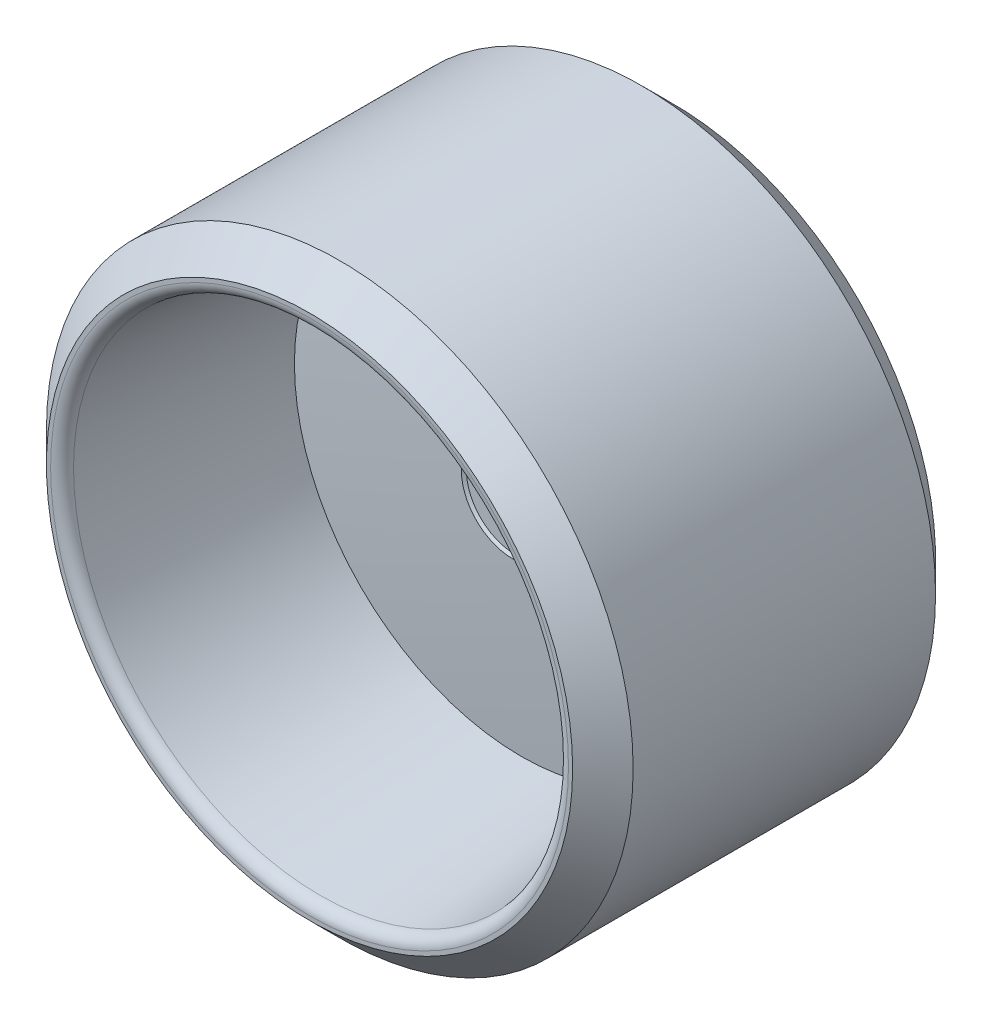
ISO-10303-21;
HEADER;
FILE_DESCRIPTION(('STEP AP214'),'2;1');
FILE_NAME('part.step','',(''),(''),'','','');
FILE_SCHEMA(('AUTOMOTIVE_DESIGN { 1 0 10303 214 1 1 1 1 }'));
ENDSEC;
DATA;
#1=APPLICATION_CONTEXT('core data for automotive mechanical design processes');
#2=APPLICATION_PROTOCOL_DEFINITION('international standard','automotive_design',2000,#1);
#3=PRODUCT_CONTEXT('',#1,'mechanical');
#4=PRODUCT('Part','Part','',(#3));
#5=PRODUCT_RELATED_PRODUCT_CATEGORY('part','',(#4));
#6=PRODUCT_DEFINITION_FORMATION('','',#4);
#7=PRODUCT_DEFINITION_CONTEXT('part definition',#1,'design');
#8=PRODUCT_DEFINITION('design','',#6,#7);
#9=PRODUCT_DEFINITION_SHAPE('','',#8);
#10=(LENGTH_UNIT() NAMED_UNIT(*) SI_UNIT(.MILLI.,.METRE.));
#11=(NAMED_UNIT(*) PLANE_ANGLE_UNIT() SI_UNIT($,.RADIAN.));
#12=(NAMED_UNIT(*) SI_UNIT($,.STERADIAN.) SOLID_ANGLE_UNIT());
#13=UNCERTAINTY_MEASURE_WITH_UNIT(LENGTH_MEASURE(1.E-05),#10,'distance_accuracy_value','');
#14=(GEOMETRIC_REPRESENTATION_CONTEXT(3) GLOBAL_UNCERTAINTY_ASSIGNED_CONTEXT((#13)) GLOBAL_UNIT_ASSIGNED_CONTEXT((#10,
#11,#12)) REPRESENTATION_CONTEXT('',''));
#15=CARTESIAN_POINT('',(0.,0.,0.));
#16=DIRECTION('',(0.,0.,1.));
#17=DIRECTION('',(1.,0.,0.));
#18=AXIS2_PLACEMENT_3D('',#15,#16,#17);
#19=CARTESIAN_POINT('',(0.,0.,0.));
#20=DIRECTION('',(0.,0.,-1.));
#21=DIRECTION('',(-1.,0.,0.));
#22=AXIS2_PLACEMENT_3D('',#19,#20,#21);
#23=PLANE('',#22);
#24=CARTESIAN_POINT('',(0.,0.,0.));
#25=DIRECTION('',(0.,0.,1.));
#26=DIRECTION('',(1.,0.,0.));
#27=AXIS2_PLACEMENT_3D('',#24,#25,#26);
#28=CIRCLE('',#27,4.);
#29=CARTESIAN_POINT('',(4.,0.,0.));
#30=VERTEX_POINT('',#29);
#31=EDGE_CURVE('E69',#30,#30,#28,.T.);
#32=ORIENTED_EDGE('',*,*,#31,.F.);
#33=EDGE_LOOP('',(#32));
#34=FACE_BOUND('',#33,.T.);
#35=ADVANCED_FACE('F31',(#34),#23,.T.);
#36=CARTESIAN_POINT('',(0.,0.,-2.));
#37=DIRECTION('',(0.,0.,-1.));
#38=DIRECTION('',(-1.,0.,0.));
#39=AXIS2_PLACEMENT_3D('',#36,#37,#38);
#40=CONICAL_SURFACE('',#39,5.89470027858602,0.758368079501479);
#41=CARTESIAN_POINT('',(0.,0.,-1.87509506141449));
#42=DIRECTION('',(0.,0.,1.));
#43=DIRECTION('',(1.,0.,0.));
#44=AXIS2_PLACEMENT_3D('',#41,#42,#43);
#45=CIRCLE('',#44,5.77637156761865);
#46=CARTESIAN_POINT('',(5.77637156761865,0.,-1.87509506141449));
#47=VERTEX_POINT('',#46);
#48=EDGE_CURVE('E42',#47,#47,#45,.F.);
#49=ORIENTED_EDGE('',*,*,#48,.T.);
#50=EDGE_LOOP('',(#49));
#51=FACE_BOUND('',#50,.T.);
#52=ORIENTED_EDGE('',*,*,#31,.T.);
#53=EDGE_LOOP('',(#52));
#54=FACE_BOUND('',#53,.T.);
#55=ADVANCED_FACE('F93',(#51,#54),#40,.F.);
#56=CARTESIAN_POINT('',(5.89470027858602,0.,-2.));
#57=DIRECTION('',(0.,0.,-1.));
#58=DIRECTION('',(-1.,0.,0.));
#59=AXIS2_PLACEMENT_3D('',#56,#57,#58);
#60=PLANE('',#59);
#61=CARTESIAN_POINT('',(0.,0.,-2.));
#62=DIRECTION('',(0.,0.,-1.));
#63=DIRECTION('',(-1.,0.,0.));
#64=AXIS2_PLACEMENT_3D('',#61,#62,#63);
#65=CIRCLE('',#64,6.06675529165525);
#66=CARTESIAN_POINT('',(-6.06675529165525,0.,-2.));
#67=VERTEX_POINT('',#66);
#68=EDGE_CURVE('E46',#67,#67,#65,.F.);
#69=ORIENTED_EDGE('',*,*,#68,.T.);
#70=EDGE_LOOP('',(#69));
#71=FACE_BOUND('',#70,.T.);
#72=CARTESIAN_POINT('',(0.,0.,-2.));
#73=DIRECTION('',(0.,0.,-1.));
#74=DIRECTION('',(-1.,0.,0.));
#75=AXIS2_PLACEMENT_3D('',#72,#73,#74);
#76=CIRCLE('',#75,8.69999999999999);
#77=CARTESIAN_POINT('',(-8.69999999999999,0.,-2.));
#78=VERTEX_POINT('',#77);
#79=EDGE_CURVE('E60',#78,#78,#76,.T.);
#80=ORIENTED_EDGE('',*,*,#79,.T.);
#81=EDGE_LOOP('',(#80));
#82=FACE_BOUND('',#81,.T.);
#83=ADVANCED_FACE('F99',(#71,#82),#60,.T.);
#84=CARTESIAN_POINT('',(0.,0.,3.));
#85=DIRECTION('',(0.,0.,1.));
#86=DIRECTION('',(1.,0.,0.));
#87=AXIS2_PLACEMENT_3D('',#84,#85,#86);
#88=CYLINDRICAL_SURFACE('',#87,9.7);
#89=CARTESIAN_POINT('',(0.,0.,-0.999999999999997));
#90=DIRECTION('',(0.,0.,-1.));
#91=DIRECTION('',(-1.,0.,0.));
#92=AXIS2_PLACEMENT_3D('',#89,#90,#91);
#93=CIRCLE('',#92,9.7);
#94=CARTESIAN_POINT('',(-9.7,0.,-0.999999999999997));
#95=VERTEX_POINT('',#94);
#96=EDGE_CURVE('E63',#95,#95,#93,.F.);
#97=ORIENTED_EDGE('',*,*,#96,.T.);
#98=EDGE_LOOP('',(#97));
#99=FACE_BOUND('',#98,.T.);
#100=CARTESIAN_POINT('',(0.,0.,9.));
#101=DIRECTION('',(0.,0.,1.));
#102=DIRECTION('',(1.,0.,0.));
#103=AXIS2_PLACEMENT_3D('',#100,#101,#102);
#104=CIRCLE('',#103,9.7);
#105=CARTESIAN_POINT('',(9.7,0.,9.));
#106=VERTEX_POINT('',#105);
#107=EDGE_CURVE('E66',#106,#106,#104,.F.);
#108=ORIENTED_EDGE('',*,*,#107,.T.);
#109=EDGE_LOOP('',(#108));
#110=FACE_BOUND('',#109,.T.);
#111=ADVANCED_FACE('F89',(#99,#110),#88,.T.);
#112=CARTESIAN_POINT('',(9.7,0.,10.));
#113=DIRECTION('',(0.,0.,1.));
#114=DIRECTION('',(1.,0.,0.));
#115=AXIS2_PLACEMENT_3D('',#112,#113,#114);
#116=PLANE('',#115);
#117=CARTESIAN_POINT('',(0.,0.,10.));
#118=DIRECTION('',(0.,0.,1.));
#119=DIRECTION('',(1.,0.,0.));
#120=AXIS2_PLACEMENT_3D('',#117,#118,#119);
#121=CIRCLE('',#120,8.56199502484483);
#122=CARTESIAN_POINT('',(8.56199502484483,0.,10.));
#123=VERTEX_POINT('',#122);
#124=EDGE_CURVE('E51',#123,#123,#121,.F.);
#125=ORIENTED_EDGE('',*,*,#124,.T.);
#126=EDGE_LOOP('',(#125));
#127=FACE_BOUND('',#126,.T.);
#128=CARTESIAN_POINT('',(0.,0.,10.));
#129=DIRECTION('',(0.,0.,1.));
#130=DIRECTION('',(1.,0.,0.));
#131=AXIS2_PLACEMENT_3D('',#128,#129,#130);
#132=CIRCLE('',#131,8.7);
#133=CARTESIAN_POINT('',(8.7,0.,10.));
#134=VERTEX_POINT('',#133);
#135=EDGE_CURVE('E57',#134,#134,#132,.T.);
#136=ORIENTED_EDGE('',*,*,#135,.T.);
#137=EDGE_LOOP('',(#136));
#138=FACE_BOUND('',#137,.T.);
#139=ADVANCED_FACE('F80',(#127,#138),#116,.T.);
#140=CARTESIAN_POINT('',(0.,0.,3.));
#141=DIRECTION('',(0.,0.,1.));
#142=DIRECTION('',(1.,0.,0.));
#143=AXIS2_PLACEMENT_3D('',#140,#141,#142);
#144=CONICAL_SURFACE('',#143,7.5,0.0996686524911619);
#145=CARTESIAN_POINT('',(0.,0.,9.6398014876084));
#146=DIRECTION('',(0.,0.,-1.));
#147=DIRECTION('',(-1.,0.,0.));
#148=AXIS2_PLACEMENT_3D('',#145,#146,#147);
#149=CIRCLE('',#148,8.16398014876084);
#150=CARTESIAN_POINT('',(-8.16398014876084,0.,9.6398014876084));
#151=VERTEX_POINT('',#150);
#152=EDGE_CURVE('E54',#151,#151,#149,.F.);
#153=ORIENTED_EDGE('',*,*,#152,.T.);
#154=EDGE_LOOP('',(#153));
#155=FACE_BOUND('',#154,.T.);
#156=CARTESIAN_POINT('',(0.,0.,3.));
#157=DIRECTION('',(0.,0.,1.));
#158=DIRECTION('',(1.,0.,0.));
#159=AXIS2_PLACEMENT_3D('',#156,#157,#158);
#160=CIRCLE('',#159,7.5);
#161=CARTESIAN_POINT('',(7.5,0.,3.));
#162=VERTEX_POINT('',#161);
#163=EDGE_CURVE('E72',#162,#162,#160,.T.);
#164=ORIENTED_EDGE('',*,*,#163,.F.);
#165=EDGE_LOOP('',(#164));
#166=FACE_BOUND('',#165,.T.);
#167=ADVANCED_FACE('F78',(#155,#166),#144,.F.);
#168=CARTESIAN_POINT('',(0.,0.,-96.2178842927729));
#169=DIRECTION('',(0.,0.,1.));
#170=DIRECTION('',(1.,0.,0.));
#171=AXIS2_PLACEMENT_3D('',#168,#169,#170);
#172=DEGENERATE_TOROIDAL_SURFACE('',#171,0.224715371710925,99.5181380006078,.F.);
#173=CARTESIAN_POINT('',(0.,0.,3.28163269177155));
#174=DIRECTION('',(0.,0.,-1.));
#175=DIRECTION('',(-1.,0.,0.));
#176=AXIS2_PLACEMENT_3D('',#173,#174,#175);
#177=CIRCLE('',#176,1.70035889967934);
#178=CARTESIAN_POINT('',(-1.70035889967934,0.,3.28163269177155));
#179=VERTEX_POINT('',#178);
#180=EDGE_CURVE('E38',#179,#179,#177,.T.);
#181=ORIENTED_EDGE('',*,*,#180,.T.);
#182=EDGE_LOOP('',(#181));
#183=FACE_BOUND('',#182,.T.);
#184=ORIENTED_EDGE('',*,*,#163,.T.);
#185=EDGE_LOOP('',(#184));
#186=FACE_BOUND('',#185,.T.);
#187=ADVANCED_FACE('F76',(#183,#186),#172,.F.);
#188=CARTESIAN_POINT('',(0.,0.,-0.999999999999997));
#189=DIRECTION('',(0.,0.,1.));
#190=DIRECTION('',(1.,0.,0.));
#191=AXIS2_PLACEMENT_3D('',#188,#189,#190);
#192=CONICAL_SURFACE('',#191,9.7,0.78539816339745);
#193=ORIENTED_EDGE('',*,*,#79,.F.);
#194=EDGE_LOOP('',(#193));
#195=FACE_BOUND('',#194,.T.);
#196=ORIENTED_EDGE('',*,*,#96,.F.);
#197=EDGE_LOOP('',(#196));
#198=FACE_BOUND('',#197,.T.);
#199=ADVANCED_FACE('F87',(#195,#198),#192,.T.);
#200=CARTESIAN_POINT('',(0.,0.,10.));
#201=DIRECTION('',(0.,0.,-1.));
#202=DIRECTION('',(-1.,0.,0.));
#203=AXIS2_PLACEMENT_3D('',#200,#201,#202);
#204=CONICAL_SURFACE('',#203,8.7,0.785398163397447);
#205=ORIENTED_EDGE('',*,*,#107,.F.);
#206=EDGE_LOOP('',(#205));
#207=FACE_BOUND('',#206,.T.);
#208=ORIENTED_EDGE('',*,*,#135,.F.);
#209=EDGE_LOOP('',(#208));
#210=FACE_BOUND('',#209,.T.);
#211=ADVANCED_FACE('F107',(#207,#210),#204,.T.);
#212=CARTESIAN_POINT('',(0.,0.,9.6));
#213=DIRECTION('',(0.,0.,1.));
#214=DIRECTION('',(1.,0.,0.));
#215=AXIS2_PLACEMENT_3D('',#212,#213,#214);
#216=TOROIDAL_SURFACE('',#215,8.56199502484483,0.4);
#217=ORIENTED_EDGE('',*,*,#124,.F.);
#218=EDGE_LOOP('',(#217));
#219=FACE_BOUND('',#218,.T.);
#220=ORIENTED_EDGE('',*,*,#152,.F.);
#221=EDGE_LOOP('',(#220));
#222=FACE_BOUND('',#221,.T.);
#223=ADVANCED_FACE('F111',(#219,#222),#216,.T.);
#224=CARTESIAN_POINT('',(0.,0.,-1.6));
#225=DIRECTION('',(0.,0.,-1.));
#226=DIRECTION('',(-1.,0.,0.));
#227=AXIS2_PLACEMENT_3D('',#224,#225,#226);
#228=TOROIDAL_SURFACE('',#227,6.06675529165525,0.4);
#229=ORIENTED_EDGE('',*,*,#48,.F.);
#230=EDGE_LOOP('',(#229));
#231=FACE_BOUND('',#230,.T.);
#232=ORIENTED_EDGE('',*,*,#68,.F.);
#233=EDGE_LOOP('',(#232));
#234=FACE_BOUND('',#233,.T.);
#235=ADVANCED_FACE('F114',(#231,#234),#228,.T.);
#236=CARTESIAN_POINT('',(0.,0.,3.2));
#237=DIRECTION('',(0.,0.,1.));
#238=DIRECTION('',(1.,0.,0.));
#239=AXIS2_PLACEMENT_3D('',#236,#237,#238);
#240=PLANE('',#239);
#241=CARTESIAN_POINT('',(0.,0.,3.2));
#242=DIRECTION('',(0.,0.,1.));
#243=DIRECTION('',(1.,0.,0.));
#244=AXIS2_PLACEMENT_3D('',#241,#242,#243);
#245=CIRCLE('',#244,1.61567886619003);
#246=CARTESIAN_POINT('',(1.61567886619003,0.,3.2));
#247=VERTEX_POINT('',#246);
#248=EDGE_CURVE('E10',#247,#247,#245,.T.);
#249=ORIENTED_EDGE('',*,*,#248,.T.);
#250=EDGE_LOOP('',(#249));
#251=FACE_BOUND('',#250,.T.);
#252=ADVANCED_FACE('F117',(#251),#240,.T.);
#253=CARTESIAN_POINT('',(0.,0.,3.08848401637245));
#254=DIRECTION('',(0.,0.,1.));
#255=DIRECTION('',(1.,0.,0.));
#256=AXIS2_PLACEMENT_3D('',#253,#254,#255);
#257=CONICAL_SURFACE('',#256,1.5,0.803719075117778);
#258=ORIENTED_EDGE('',*,*,#180,.F.);
#259=EDGE_LOOP('',(#258));
#260=FACE_BOUND('',#259,.T.);
#261=ORIENTED_EDGE('',*,*,#248,.F.);
#262=EDGE_LOOP('',(#261));
#263=FACE_BOUND('',#262,.T.);
#264=ADVANCED_FACE('F33',(#260,#263),#257,.F.);
#265=CLOSED_SHELL('',(#35,#55,#83,#111,#139,#167,#187,#199,#211,#223,#235,#252,#264));
#266=MANIFOLD_SOLID_BREP('B2',#265);
#267=ADVANCED_BREP_SHAPE_REPRESENTATION('',(#18,#266),#14);
#268=SHAPE_DEFINITION_REPRESENTATION(#9,#267);
ENDSEC;
END-ISO-10303-21;
